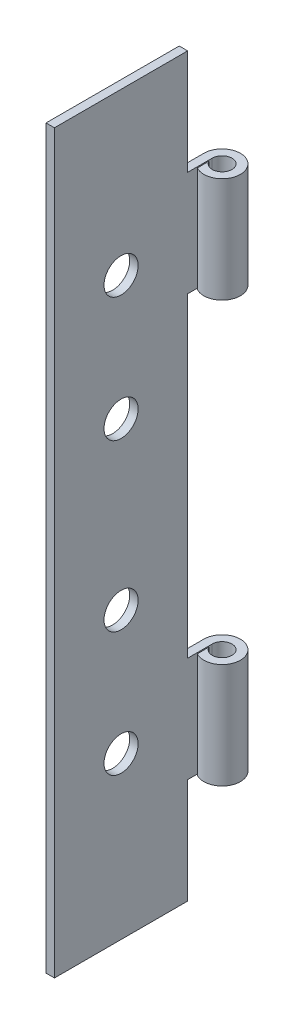
ISO-10303-21;
HEADER;
FILE_DESCRIPTION(('STEP AP214'),'2;1');
FILE_NAME('part.step','',(''),(''),'','','');
FILE_SCHEMA(('AUTOMOTIVE_DESIGN { 1 0 10303 214 1 1 1 1 }'));
ENDSEC;
DATA;
#1=APPLICATION_CONTEXT('core data for automotive mechanical design processes');
#2=APPLICATION_PROTOCOL_DEFINITION('international standard','automotive_design',2000,#1);
#3=PRODUCT_CONTEXT('',#1,'mechanical');
#4=PRODUCT('Part','Part','',(#3));
#5=PRODUCT_RELATED_PRODUCT_CATEGORY('part','',(#4));
#6=PRODUCT_DEFINITION_FORMATION('','',#4);
#7=PRODUCT_DEFINITION_CONTEXT('part definition',#1,'design');
#8=PRODUCT_DEFINITION('design','',#6,#7);
#9=PRODUCT_DEFINITION_SHAPE('','',#8);
#10=(LENGTH_UNIT() NAMED_UNIT(*) SI_UNIT(.MILLI.,.METRE.));
#11=(NAMED_UNIT(*) PLANE_ANGLE_UNIT() SI_UNIT($,.RADIAN.));
#12=(NAMED_UNIT(*) SI_UNIT($,.STERADIAN.) SOLID_ANGLE_UNIT());
#13=UNCERTAINTY_MEASURE_WITH_UNIT(LENGTH_MEASURE(1.E-05),#10,'distance_accuracy_value','');
#14=(GEOMETRIC_REPRESENTATION_CONTEXT(3) GLOBAL_UNCERTAINTY_ASSIGNED_CONTEXT((#13)) GLOBAL_UNIT_ASSIGNED_CONTEXT((#10,
#11,#12)) REPRESENTATION_CONTEXT('',''));
#15=CARTESIAN_POINT('',(0.,0.,0.));
#16=DIRECTION('',(0.,0.,1.));
#17=DIRECTION('',(1.,0.,0.));
#18=AXIS2_PLACEMENT_3D('',#15,#16,#17);
#19=CARTESIAN_POINT('',(0.,88.9,0.));
#20=DIRECTION('',(1.,0.,0.));
#21=DIRECTION('',(0.,0.,-1.));
#22=AXIS2_PLACEMENT_3D('',#19,#20,#21);
#23=PLANE('',#22);
#24=CARTESIAN_POINT('',(0.,19.450000028,11.0093125));
#25=DIRECTION('',(-1.,0.,0.));
#26=DIRECTION('',(0.,0.,-1.));
#27=AXIS2_PLACEMENT_3D('',#24,#25,#26);
#28=CIRCLE('',#27,2.06);
#29=CARTESIAN_POINT('',(0.,19.450000028,8.9493125));
#30=VERTEX_POINT('',#29);
#31=EDGE_CURVE('E385',#30,#30,#28,.T.);
#32=ORIENTED_EDGE('',*,*,#31,.F.);
#33=EDGE_LOOP('',(#32));
#34=FACE_BOUND('',#33,.T.);
#35=CARTESIAN_POINT('',(0.,69.449999972,11.0093125));
#36=DIRECTION('',(-1.,0.,0.));
#37=DIRECTION('',(0.,0.,1.));
#38=AXIS2_PLACEMENT_3D('',#35,#36,#37);
#39=CIRCLE('',#38,2.06);
#40=CARTESIAN_POINT('',(0.,69.449999972,13.0693125));
#41=VERTEX_POINT('',#40);
#42=EDGE_CURVE('E389',#41,#41,#39,.T.);
#43=ORIENTED_EDGE('',*,*,#42,.F.);
#44=EDGE_LOOP('',(#43));
#45=FACE_BOUND('',#44,.T.);
#46=CARTESIAN_POINT('',(0.,34.45,11.0093125));
#47=DIRECTION('',(-1.,0.,0.));
#48=DIRECTION('',(0.,0.,-1.));
#49=AXIS2_PLACEMENT_3D('',#46,#47,#48);
#50=CIRCLE('',#49,2.06);
#51=CARTESIAN_POINT('',(0.,34.45,8.9493125));
#52=VERTEX_POINT('',#51);
#53=EDGE_CURVE('E384',#52,#52,#50,.T.);
#54=ORIENTED_EDGE('',*,*,#53,.F.);
#55=EDGE_LOOP('',(#54));
#56=FACE_BOUND('',#55,.T.);
#57=CARTESIAN_POINT('',(0.,54.45,11.0093125));
#58=DIRECTION('',(-1.,0.,0.));
#59=DIRECTION('',(0.,0.,1.));
#60=AXIS2_PLACEMENT_3D('',#57,#58,#59);
#61=CIRCLE('',#60,2.06);
#62=CARTESIAN_POINT('',(0.,54.45,13.0693125));
#63=VERTEX_POINT('',#62);
#64=EDGE_CURVE('E248',#63,#63,#61,.T.);
#65=ORIENTED_EDGE('',*,*,#64,.F.);
#66=EDGE_LOOP('',(#65));
#67=FACE_BOUND('',#66,.T.);
#68=DIRECTION('',(0.,-1.,0.));
#69=VECTOR('',#68,1.);
#70=CARTESIAN_POINT('',(0.,63.5,2.968625));
#71=LINE('',#70,#69);
#72=CARTESIAN_POINT('',(0.,63.5,2.968625));
#73=VERTEX_POINT('',#72);
#74=CARTESIAN_POINT('',(0.,25.4,2.968625));
#75=VERTEX_POINT('',#74);
#76=EDGE_CURVE('E363',#73,#75,#71,.T.);
#77=ORIENTED_EDGE('',*,*,#76,.T.);
#78=DIRECTION('',(0.,0.,-1.));
#79=VECTOR('',#78,1.);
#80=CARTESIAN_POINT('',(0.,25.4,2.968625));
#81=LINE('',#80,#79);
#82=CARTESIAN_POINT('',(0.,25.4,0.));
#83=VERTEX_POINT('',#82);
#84=EDGE_CURVE('E274',#75,#83,#81,.T.);
#85=ORIENTED_EDGE('',*,*,#84,.T.);
#86=DIRECTION('',(0.,-1.,0.));
#87=VECTOR('',#86,1.);
#88=CARTESIAN_POINT('',(0.,88.9,0.));
#89=LINE('',#88,#87);
#90=CARTESIAN_POINT('',(0.,12.7,0.));
#91=VERTEX_POINT('',#90);
#92=EDGE_CURVE('E225',#83,#91,#89,.T.);
#93=ORIENTED_EDGE('',*,*,#92,.T.);
#94=DIRECTION('',(0.,0.,1.));
#95=VECTOR('',#94,1.);
#96=CARTESIAN_POINT('',(0.,12.7,2.968625));
#97=LINE('',#96,#95);
#98=CARTESIAN_POINT('',(0.,12.7,2.968625));
#99=VERTEX_POINT('',#98);
#100=EDGE_CURVE('E180',#91,#99,#97,.T.);
#101=ORIENTED_EDGE('',*,*,#100,.T.);
#102=DIRECTION('',(0.,-1.,0.));
#103=VECTOR('',#102,1.);
#104=CARTESIAN_POINT('',(0.,12.7,2.968625));
#105=LINE('',#104,#103);
#106=CARTESIAN_POINT('',(0.,0.,2.968625));
#107=VERTEX_POINT('',#106);
#108=EDGE_CURVE('E163',#99,#107,#105,.T.);
#109=ORIENTED_EDGE('',*,*,#108,.T.);
#110=DIRECTION('',(0.,0.,1.));
#111=VECTOR('',#110,1.);
#112=CARTESIAN_POINT('',(0.,0.,0.));
#113=LINE('',#112,#111);
#114=CARTESIAN_POINT('',(0.,0.,19.05));
#115=VERTEX_POINT('',#114);
#116=EDGE_CURVE('E177',#107,#115,#113,.T.);
#117=ORIENTED_EDGE('',*,*,#116,.T.);
#118=DIRECTION('',(0.,-1.,0.));
#119=VECTOR('',#118,1.);
#120=CARTESIAN_POINT('',(0.,88.9,19.05));
#121=LINE('',#120,#119);
#122=CARTESIAN_POINT('',(0.,88.9,19.05));
#123=VERTEX_POINT('',#122);
#124=EDGE_CURVE('E222',#123,#115,#121,.T.);
#125=ORIENTED_EDGE('',*,*,#124,.F.);
#126=DIRECTION('',(0.,0.,1.));
#127=VECTOR('',#126,1.);
#128=CARTESIAN_POINT('',(0.,88.9,0.));
#129=LINE('',#128,#127);
#130=CARTESIAN_POINT('',(0.,88.9,2.968625));
#131=VERTEX_POINT('',#130);
#132=EDGE_CURVE('E202',#131,#123,#129,.T.);
#133=ORIENTED_EDGE('',*,*,#132,.F.);
#134=DIRECTION('',(0.,-1.,0.));
#135=VECTOR('',#134,1.);
#136=CARTESIAN_POINT('',(0.,88.9,2.968625));
#137=LINE('',#136,#135);
#138=CARTESIAN_POINT('',(0.,76.2,2.968625));
#139=VERTEX_POINT('',#138);
#140=EDGE_CURVE('E70',#131,#139,#137,.T.);
#141=ORIENTED_EDGE('',*,*,#140,.T.);
#142=DIRECTION('',(0.,0.,-1.));
#143=VECTOR('',#142,1.);
#144=CARTESIAN_POINT('',(0.,76.2,2.968625));
#145=LINE('',#144,#143);
#146=CARTESIAN_POINT('',(0.,76.2,0.));
#147=VERTEX_POINT('',#146);
#148=EDGE_CURVE('E261',#139,#147,#145,.T.);
#149=ORIENTED_EDGE('',*,*,#148,.T.);
#150=CARTESIAN_POINT('',(0.,63.5,0.));
#151=VERTEX_POINT('',#150);
#152=EDGE_CURVE('E173',#147,#151,#89,.T.);
#153=ORIENTED_EDGE('',*,*,#152,.T.);
#154=DIRECTION('',(0.,0.,1.));
#155=VECTOR('',#154,1.);
#156=CARTESIAN_POINT('',(0.,63.5,2.968625));
#157=LINE('',#156,#155);
#158=EDGE_CURVE('E365',#151,#73,#157,.T.);
#159=ORIENTED_EDGE('',*,*,#158,.T.);
#160=EDGE_LOOP('',(#77,#85,#93,#101,#109,#117,#125,#133,#141,#149,#153,#159));
#161=FACE_BOUND('',#160,.T.);
#162=ADVANCED_FACE('F44',(#34,#45,#56,#67,#161),#23,.F.);
#163=CARTESIAN_POINT('',(1.016,88.9,19.05));
#164=DIRECTION('',(-1.,0.,0.));
#165=DIRECTION('',(0.,0.,1.));
#166=AXIS2_PLACEMENT_3D('',#163,#164,#165);
#167=PLANE('',#166);
#168=CARTESIAN_POINT('',(1.016,19.450000028,11.0093125));
#169=DIRECTION('',(-1.,0.,0.));
#170=DIRECTION('',(0.,0.,1.));
#171=AXIS2_PLACEMENT_3D('',#168,#169,#170);
#172=CIRCLE('',#171,2.06);
#173=CARTESIAN_POINT('',(1.016,19.450000028,13.0693125));
#174=VERTEX_POINT('',#173);
#175=EDGE_CURVE('E48',#174,#174,#172,.T.);
#176=ORIENTED_EDGE('',*,*,#175,.T.);
#177=EDGE_LOOP('',(#176));
#178=FACE_BOUND('',#177,.T.);
#179=CARTESIAN_POINT('',(1.016,69.449999972,11.0093125));
#180=DIRECTION('',(-1.,0.,0.));
#181=DIRECTION('',(0.,0.,1.));
#182=AXIS2_PLACEMENT_3D('',#179,#180,#181);
#183=CIRCLE('',#182,2.06);
#184=CARTESIAN_POINT('',(1.016,69.449999972,13.0693125));
#185=VERTEX_POINT('',#184);
#186=EDGE_CURVE('E251',#185,#185,#183,.T.);
#187=ORIENTED_EDGE('',*,*,#186,.T.);
#188=EDGE_LOOP('',(#187));
#189=FACE_BOUND('',#188,.T.);
#190=CARTESIAN_POINT('',(1.016,34.45,11.0093125));
#191=DIRECTION('',(-1.,0.,0.));
#192=DIRECTION('',(0.,0.,1.));
#193=AXIS2_PLACEMENT_3D('',#190,#191,#192);
#194=CIRCLE('',#193,2.06);
#195=CARTESIAN_POINT('',(1.016,34.45,13.0693125));
#196=VERTEX_POINT('',#195);
#197=EDGE_CURVE('E247',#196,#196,#194,.T.);
#198=ORIENTED_EDGE('',*,*,#197,.T.);
#199=EDGE_LOOP('',(#198));
#200=FACE_BOUND('',#199,.T.);
#201=CARTESIAN_POINT('',(1.016,54.45,11.0093125));
#202=DIRECTION('',(-1.,0.,0.));
#203=DIRECTION('',(0.,0.,1.));
#204=AXIS2_PLACEMENT_3D('',#201,#202,#203);
#205=CIRCLE('',#204,2.06);
#206=CARTESIAN_POINT('',(1.016,54.45,13.0693125));
#207=VERTEX_POINT('',#206);
#208=EDGE_CURVE('E243',#207,#207,#205,.T.);
#209=ORIENTED_EDGE('',*,*,#208,.T.);
#210=EDGE_LOOP('',(#209));
#211=FACE_BOUND('',#210,.T.);
#212=DIRECTION('',(0.,-1.,0.));
#213=VECTOR('',#212,1.);
#214=CARTESIAN_POINT('',(1.016,88.9,2.968625));
#215=LINE('',#214,#213);
#216=CARTESIAN_POINT('',(1.016,63.5,2.968625));
#217=VERTEX_POINT('',#216);
#218=CARTESIAN_POINT('',(1.016,25.4,2.968625));
#219=VERTEX_POINT('',#218);
#220=EDGE_CURVE('E11',#217,#219,#215,.T.);
#221=ORIENTED_EDGE('',*,*,#220,.F.);
#222=DIRECTION('',(0.,0.,1.));
#223=VECTOR('',#222,1.);
#224=CARTESIAN_POINT('',(1.016,63.5,19.05));
#225=LINE('',#224,#223);
#226=CARTESIAN_POINT('',(1.016,63.5,0.));
#227=VERTEX_POINT('',#226);
#228=EDGE_CURVE('E302',#227,#217,#225,.T.);
#229=ORIENTED_EDGE('',*,*,#228,.F.);
#230=DIRECTION('',(0.,-1.,0.));
#231=VECTOR('',#230,1.);
#232=CARTESIAN_POINT('',(1.016,88.9,0.));
#233=LINE('',#232,#231);
#234=CARTESIAN_POINT('',(1.016,76.2,0.));
#235=VERTEX_POINT('',#234);
#236=EDGE_CURVE('E217',#235,#227,#233,.T.);
#237=ORIENTED_EDGE('',*,*,#236,.F.);
#238=DIRECTION('',(0.,0.,-1.));
#239=VECTOR('',#238,1.);
#240=CARTESIAN_POINT('',(1.016,76.2,19.05));
#241=LINE('',#240,#239);
#242=CARTESIAN_POINT('',(1.016,76.2,2.968625));
#243=VERTEX_POINT('',#242);
#244=EDGE_CURVE('E284',#243,#235,#241,.T.);
#245=ORIENTED_EDGE('',*,*,#244,.F.);
#246=DIRECTION('',(0.,-1.,0.));
#247=VECTOR('',#246,1.);
#248=CARTESIAN_POINT('',(1.016,88.9,2.968625));
#249=LINE('',#248,#247);
#250=CARTESIAN_POINT('',(1.016,88.9,2.968625));
#251=VERTEX_POINT('',#250);
#252=EDGE_CURVE('E277',#251,#243,#249,.T.);
#253=ORIENTED_EDGE('',*,*,#252,.F.);
#254=DIRECTION('',(0.,0.,-1.));
#255=VECTOR('',#254,1.);
#256=CARTESIAN_POINT('',(1.016,88.9,19.05));
#257=LINE('',#256,#255);
#258=CARTESIAN_POINT('',(1.016,88.9,19.05));
#259=VERTEX_POINT('',#258);
#260=EDGE_CURVE('E197',#259,#251,#257,.T.);
#261=ORIENTED_EDGE('',*,*,#260,.F.);
#262=DIRECTION('',(0.,-1.,0.));
#263=VECTOR('',#262,1.);
#264=CARTESIAN_POINT('',(1.016,88.9,19.05));
#265=LINE('',#264,#263);
#266=CARTESIAN_POINT('',(1.016,0.,19.05));
#267=VERTEX_POINT('',#266);
#268=EDGE_CURVE('E218',#259,#267,#265,.T.);
#269=ORIENTED_EDGE('',*,*,#268,.T.);
#270=DIRECTION('',(0.,0.,-1.));
#271=VECTOR('',#270,1.);
#272=CARTESIAN_POINT('',(1.016,0.,19.05));
#273=LINE('',#272,#271);
#274=CARTESIAN_POINT('',(1.016,0.,2.968625));
#275=VERTEX_POINT('',#274);
#276=EDGE_CURVE('E192',#267,#275,#273,.T.);
#277=ORIENTED_EDGE('',*,*,#276,.T.);
#278=DIRECTION('',(0.,-1.,0.));
#279=VECTOR('',#278,1.);
#280=CARTESIAN_POINT('',(1.016,88.9,2.968625));
#281=LINE('',#280,#279);
#282=CARTESIAN_POINT('',(1.016,12.7,2.968625));
#283=VERTEX_POINT('',#282);
#284=EDGE_CURVE('E166',#283,#275,#281,.T.);
#285=ORIENTED_EDGE('',*,*,#284,.F.);
#286=DIRECTION('',(0.,0.,1.));
#287=VECTOR('',#286,1.);
#288=CARTESIAN_POINT('',(1.016,12.7,19.05));
#289=LINE('',#288,#287);
#290=CARTESIAN_POINT('',(1.016,12.7,0.));
#291=VERTEX_POINT('',#290);
#292=EDGE_CURVE('E194',#291,#283,#289,.T.);
#293=ORIENTED_EDGE('',*,*,#292,.F.);
#294=CARTESIAN_POINT('',(1.016,25.4,0.));
#295=VERTEX_POINT('',#294);
#296=EDGE_CURVE('E213',#295,#291,#233,.T.);
#297=ORIENTED_EDGE('',*,*,#296,.F.);
#298=DIRECTION('',(0.,0.,-1.));
#299=VECTOR('',#298,1.);
#300=CARTESIAN_POINT('',(1.016,25.4,19.05));
#301=LINE('',#300,#299);
#302=EDGE_CURVE('E293',#219,#295,#301,.T.);
#303=ORIENTED_EDGE('',*,*,#302,.F.);
#304=EDGE_LOOP('',(#221,#229,#237,#245,#253,#261,#269,#277,#285,#293,#297,#303));
#305=FACE_BOUND('',#304,.T.);
#306=ADVANCED_FACE('F325',(#178,#189,#200,#211,#305),#167,.F.);
#307=CARTESIAN_POINT('',(2.206625,88.9,0.));
#308=DIRECTION('',(0.,-1.,0.));
#309=DIRECTION('',(0.,0.,-1.));
#310=AXIS2_PLACEMENT_3D('',#307,#308,#309);
#311=CYLINDRICAL_SURFACE('',#310,2.206625);
#312=DIRECTION('',(0.,-1.,0.));
#313=VECTOR('',#312,1.);
#314=CARTESIAN_POINT('',(1.143,88.9,1.93336384315007));
#315=LINE('',#314,#313);
#316=CARTESIAN_POINT('',(1.143,25.4,1.93336384315007));
#317=VERTEX_POINT('',#316);
#318=CARTESIAN_POINT('',(1.143,12.7,1.93336384315007));
#319=VERTEX_POINT('',#318);
#320=EDGE_CURVE('E203',#317,#319,#315,.T.);
#321=ORIENTED_EDGE('',*,*,#320,.T.);
#322=CARTESIAN_POINT('',(2.206625,12.7,0.));
#323=DIRECTION('',(0.,-1.,0.));
#324=DIRECTION('',(0.,0.,-1.));
#325=AXIS2_PLACEMENT_3D('',#322,#323,#324);
#326=CIRCLE('',#325,2.206625);
#327=EDGE_CURVE('E188',#91,#319,#326,.T.);
#328=ORIENTED_EDGE('',*,*,#327,.F.);
#329=ORIENTED_EDGE('',*,*,#92,.F.);
#330=CARTESIAN_POINT('',(2.206625,25.4,0.));
#331=DIRECTION('',(0.,1.,0.));
#332=DIRECTION('',(0.,0.,1.));
#333=AXIS2_PLACEMENT_3D('',#330,#331,#332);
#334=CIRCLE('',#333,2.206625);
#335=EDGE_CURVE('E296',#317,#83,#334,.T.);
#336=ORIENTED_EDGE('',*,*,#335,.F.);
#337=EDGE_LOOP('',(#321,#328,#329,#336));
#338=FACE_BOUND('',#337,.T.);
#339=ADVANCED_FACE('F46',(#338),#311,.T.);
#340=CARTESIAN_POINT('',(1.143,76.2,1.93336384315007));
#341=VERTEX_POINT('',#340);
#342=CARTESIAN_POINT('',(1.143,63.5,1.93336384315007));
#343=VERTEX_POINT('',#342);
#344=EDGE_CURVE('E207',#341,#343,#315,.T.);
#345=ORIENTED_EDGE('',*,*,#344,.T.);
#346=CARTESIAN_POINT('',(2.206625,63.5,0.));
#347=DIRECTION('',(0.,-1.,0.));
#348=DIRECTION('',(0.,0.,-1.));
#349=AXIS2_PLACEMENT_3D('',#346,#347,#348);
#350=CIRCLE('',#349,2.206625);
#351=EDGE_CURVE('E62',#151,#343,#350,.T.);
#352=ORIENTED_EDGE('',*,*,#351,.F.);
#353=ORIENTED_EDGE('',*,*,#152,.F.);
#354=CARTESIAN_POINT('',(2.206625,76.2,0.));
#355=DIRECTION('',(0.,1.,0.));
#356=DIRECTION('',(0.,0.,1.));
#357=AXIS2_PLACEMENT_3D('',#354,#355,#356);
#358=CIRCLE('',#357,2.206625);
#359=EDGE_CURVE('E287',#341,#147,#358,.T.);
#360=ORIENTED_EDGE('',*,*,#359,.F.);
#361=EDGE_LOOP('',(#345,#352,#353,#360));
#362=FACE_BOUND('',#361,.T.);
#363=ADVANCED_FACE('F339',(#362),#311,.T.);
#364=CARTESIAN_POINT('',(2.206625,88.9,0.));
#365=DIRECTION('',(0.,-1.,0.));
#366=DIRECTION('',(0.,0.,-1.));
#367=AXIS2_PLACEMENT_3D('',#364,#365,#366);
#368=CYLINDRICAL_SURFACE('',#367,1.190625);
#369=CARTESIAN_POINT('',(2.206625,12.7,0.));
#370=DIRECTION('',(0.,-1.,0.));
#371=DIRECTION('',(0.,0.,-1.));
#372=AXIS2_PLACEMENT_3D('',#369,#370,#371);
#373=CIRCLE('',#372,1.190625);
#374=CARTESIAN_POINT('',(1.143,12.7,0.535060510596702));
#375=VERTEX_POINT('',#374);
#376=EDGE_CURVE('E308',#375,#291,#373,.F.);
#377=ORIENTED_EDGE('',*,*,#376,.F.);
#378=DIRECTION('',(0.,-1.,0.));
#379=VECTOR('',#378,1.);
#380=CARTESIAN_POINT('',(1.143,88.9,0.535060510596702));
#381=LINE('',#380,#379);
#382=CARTESIAN_POINT('',(1.143,25.4,0.535060510596702));
#383=VERTEX_POINT('',#382);
#384=EDGE_CURVE('E208',#383,#375,#381,.T.);
#385=ORIENTED_EDGE('',*,*,#384,.F.);
#386=CARTESIAN_POINT('',(2.206625,25.4,0.));
#387=DIRECTION('',(0.,1.,0.));
#388=DIRECTION('',(0.,0.,1.));
#389=AXIS2_PLACEMENT_3D('',#386,#387,#388);
#390=CIRCLE('',#389,1.190625);
#391=EDGE_CURVE('E290',#295,#383,#390,.F.);
#392=ORIENTED_EDGE('',*,*,#391,.F.);
#393=ORIENTED_EDGE('',*,*,#296,.T.);
#394=EDGE_LOOP('',(#377,#385,#392,#393));
#395=FACE_BOUND('',#394,.T.);
#396=ADVANCED_FACE('F419',(#395),#368,.F.);
#397=CARTESIAN_POINT('',(2.206625,63.5,0.));
#398=DIRECTION('',(0.,-1.,0.));
#399=DIRECTION('',(0.,0.,-1.));
#400=AXIS2_PLACEMENT_3D('',#397,#398,#399);
#401=CIRCLE('',#400,1.190625);
#402=CARTESIAN_POINT('',(1.143,63.5,0.535060510596702));
#403=VERTEX_POINT('',#402);
#404=EDGE_CURVE('E299',#403,#227,#401,.F.);
#405=ORIENTED_EDGE('',*,*,#404,.F.);
#406=CARTESIAN_POINT('',(1.143,76.2,0.535060510596702));
#407=VERTEX_POINT('',#406);
#408=EDGE_CURVE('E212',#407,#403,#381,.T.);
#409=ORIENTED_EDGE('',*,*,#408,.F.);
#410=CARTESIAN_POINT('',(2.206625,76.2,0.));
#411=DIRECTION('',(0.,1.,0.));
#412=DIRECTION('',(0.,0.,1.));
#413=AXIS2_PLACEMENT_3D('',#410,#411,#412);
#414=CIRCLE('',#413,1.190625);
#415=EDGE_CURVE('E281',#235,#407,#414,.F.);
#416=ORIENTED_EDGE('',*,*,#415,.F.);
#417=ORIENTED_EDGE('',*,*,#236,.T.);
#418=EDGE_LOOP('',(#405,#409,#416,#417));
#419=FACE_BOUND('',#418,.T.);
#420=ADVANCED_FACE('F355',(#419),#368,.F.);
#421=CARTESIAN_POINT('',(1.143,88.9,0.535060510596702));
#422=DIRECTION('',(1.,0.,0.));
#423=DIRECTION('',(0.,0.,-1.));
#424=AXIS2_PLACEMENT_3D('',#421,#422,#423);
#425=PLANE('',#424);
#426=DIRECTION('',(0.,0.,-1.));
#427=VECTOR('',#426,1.);
#428=CARTESIAN_POINT('',(1.143,12.7,0.535060510596702));
#429=LINE('',#428,#427);
#430=EDGE_CURVE('E54',#319,#375,#429,.T.);
#431=ORIENTED_EDGE('',*,*,#430,.F.);
#432=ORIENTED_EDGE('',*,*,#320,.F.);
#433=DIRECTION('',(0.,0.,1.));
#434=VECTOR('',#433,1.);
#435=CARTESIAN_POINT('',(1.143,25.4,0.535060510596702));
#436=LINE('',#435,#434);
#437=EDGE_CURVE('E234',#383,#317,#436,.T.);
#438=ORIENTED_EDGE('',*,*,#437,.F.);
#439=ORIENTED_EDGE('',*,*,#384,.T.);
#440=EDGE_LOOP('',(#431,#432,#438,#439));
#441=FACE_BOUND('',#440,.T.);
#442=ADVANCED_FACE('F437',(#441),#425,.F.);
#443=DIRECTION('',(0.,0.,-1.));
#444=VECTOR('',#443,1.);
#445=CARTESIAN_POINT('',(1.143,63.5,0.535060510596702));
#446=LINE('',#445,#444);
#447=EDGE_CURVE('E238',#343,#403,#446,.T.);
#448=ORIENTED_EDGE('',*,*,#447,.F.);
#449=ORIENTED_EDGE('',*,*,#344,.F.);
#450=DIRECTION('',(0.,0.,1.));
#451=VECTOR('',#450,1.);
#452=CARTESIAN_POINT('',(1.143,76.2,0.535060510596702));
#453=LINE('',#452,#451);
#454=EDGE_CURVE('E230',#407,#341,#453,.T.);
#455=ORIENTED_EDGE('',*,*,#454,.F.);
#456=ORIENTED_EDGE('',*,*,#408,.T.);
#457=EDGE_LOOP('',(#448,#449,#455,#456));
#458=FACE_BOUND('',#457,.T.);
#459=ADVANCED_FACE('F349',(#458),#425,.F.);
#460=CARTESIAN_POINT('',(2.206625,88.9,0.));
#461=DIRECTION('',(0.,1.,0.));
#462=DIRECTION('',(0.,0.,1.));
#463=AXIS2_PLACEMENT_3D('',#460,#461,#462);
#464=PLANE('',#463);
#465=ORIENTED_EDGE('',*,*,#260,.T.);
#466=DIRECTION('',(-1.,0.,0.));
#467=VECTOR('',#466,1.);
#468=CARTESIAN_POINT('',(2.206625,88.9,2.968625));
#469=LINE('',#468,#467);
#470=EDGE_CURVE('E172',#251,#131,#469,.T.);
#471=ORIENTED_EDGE('',*,*,#470,.T.);
#472=ORIENTED_EDGE('',*,*,#132,.T.);
#473=DIRECTION('',(1.,0.,0.));
#474=VECTOR('',#473,1.);
#475=CARTESIAN_POINT('',(0.,88.9,19.05));
#476=LINE('',#475,#474);
#477=EDGE_CURVE('E314',#123,#259,#476,.T.);
#478=ORIENTED_EDGE('',*,*,#477,.T.);
#479=EDGE_LOOP('',(#465,#471,#472,#478));
#480=FACE_BOUND('',#479,.T.);
#481=ADVANCED_FACE('F322',(#480),#464,.T.);
#482=CARTESIAN_POINT('',(2.206625,0.,0.));
#483=DIRECTION('',(0.,1.,0.));
#484=DIRECTION('',(0.,0.,1.));
#485=AXIS2_PLACEMENT_3D('',#482,#483,#484);
#486=PLANE('',#485);
#487=DIRECTION('',(-1.,0.,0.));
#488=VECTOR('',#487,1.);
#489=CARTESIAN_POINT('',(2.206625,0.,2.968625));
#490=LINE('',#489,#488);
#491=EDGE_CURVE('E159',#275,#107,#490,.T.);
#492=ORIENTED_EDGE('',*,*,#491,.F.);
#493=ORIENTED_EDGE('',*,*,#276,.F.);
#494=DIRECTION('',(1.,0.,0.));
#495=VECTOR('',#494,1.);
#496=CARTESIAN_POINT('',(0.,0.,19.05));
#497=LINE('',#496,#495);
#498=EDGE_CURVE('E186',#115,#267,#497,.T.);
#499=ORIENTED_EDGE('',*,*,#498,.F.);
#500=ORIENTED_EDGE('',*,*,#116,.F.);
#501=EDGE_LOOP('',(#492,#493,#499,#500));
#502=FACE_BOUND('',#501,.T.);
#503=ADVANCED_FACE('F185',(#502),#486,.F.);
#504=CARTESIAN_POINT('',(0.,88.9,19.05));
#505=DIRECTION('',(0.,0.,-1.));
#506=DIRECTION('',(-1.,0.,0.));
#507=AXIS2_PLACEMENT_3D('',#504,#505,#506);
#508=PLANE('',#507);
#509=ORIENTED_EDGE('',*,*,#498,.T.);
#510=ORIENTED_EDGE('',*,*,#268,.F.);
#511=ORIENTED_EDGE('',*,*,#477,.F.);
#512=ORIENTED_EDGE('',*,*,#124,.T.);
#513=EDGE_LOOP('',(#509,#510,#511,#512));
#514=FACE_BOUND('',#513,.T.);
#515=ADVANCED_FACE('F421',(#514),#508,.F.);
#516=CARTESIAN_POINT('',(4.41325,12.7,2.968625));
#517=DIRECTION('',(0.,-1.,0.));
#518=DIRECTION('',(0.,0.,-1.));
#519=AXIS2_PLACEMENT_3D('',#516,#517,#518);
#520=PLANE('',#519);
#521=ORIENTED_EDGE('',*,*,#327,.T.);
#522=ORIENTED_EDGE('',*,*,#430,.T.);
#523=ORIENTED_EDGE('',*,*,#376,.T.);
#524=ORIENTED_EDGE('',*,*,#292,.T.);
#525=DIRECTION('',(-1.,0.,0.));
#526=VECTOR('',#525,1.);
#527=CARTESIAN_POINT('',(4.41325,12.7,2.968625));
#528=LINE('',#527,#526);
#529=EDGE_CURVE('E278',#283,#99,#528,.T.);
#530=ORIENTED_EDGE('',*,*,#529,.T.);
#531=ORIENTED_EDGE('',*,*,#100,.F.);
#532=EDGE_LOOP('',(#521,#522,#523,#524,#530,#531));
#533=FACE_BOUND('',#532,.T.);
#534=ADVANCED_FACE('F423',(#533),#520,.T.);
#535=CARTESIAN_POINT('',(4.41325,12.7,2.968625));
#536=DIRECTION('',(0.,0.,-1.));
#537=DIRECTION('',(0.,1.,0.));
#538=AXIS2_PLACEMENT_3D('',#535,#536,#537);
#539=PLANE('',#538);
#540=ORIENTED_EDGE('',*,*,#284,.T.);
#541=ORIENTED_EDGE('',*,*,#491,.T.);
#542=ORIENTED_EDGE('',*,*,#108,.F.);
#543=ORIENTED_EDGE('',*,*,#529,.F.);
#544=EDGE_LOOP('',(#540,#541,#542,#543));
#545=FACE_BOUND('',#544,.T.);
#546=ADVANCED_FACE('F161',(#545),#539,.T.);
#547=CARTESIAN_POINT('',(4.41325,76.2,2.968625));
#548=DIRECTION('',(0.,1.,0.));
#549=DIRECTION('',(0.,0.,1.));
#550=AXIS2_PLACEMENT_3D('',#547,#548,#549);
#551=PLANE('',#550);
#552=ORIENTED_EDGE('',*,*,#359,.T.);
#553=ORIENTED_EDGE('',*,*,#148,.F.);
#554=DIRECTION('',(-1.,0.,0.));
#555=VECTOR('',#554,1.);
#556=CARTESIAN_POINT('',(4.41325,76.2,2.968625));
#557=LINE('',#556,#555);
#558=EDGE_CURVE('E266',#243,#139,#557,.T.);
#559=ORIENTED_EDGE('',*,*,#558,.F.);
#560=ORIENTED_EDGE('',*,*,#244,.T.);
#561=ORIENTED_EDGE('',*,*,#415,.T.);
#562=ORIENTED_EDGE('',*,*,#454,.T.);
#563=EDGE_LOOP('',(#552,#553,#559,#560,#561,#562));
#564=FACE_BOUND('',#563,.T.);
#565=ADVANCED_FACE('F332',(#564),#551,.T.);
#566=CARTESIAN_POINT('',(4.41325,88.9,2.968625));
#567=DIRECTION('',(0.,0.,-1.));
#568=DIRECTION('',(0.,1.,0.));
#569=AXIS2_PLACEMENT_3D('',#566,#567,#568);
#570=PLANE('',#569);
#571=ORIENTED_EDGE('',*,*,#252,.T.);
#572=ORIENTED_EDGE('',*,*,#558,.T.);
#573=ORIENTED_EDGE('',*,*,#140,.F.);
#574=ORIENTED_EDGE('',*,*,#470,.F.);
#575=EDGE_LOOP('',(#571,#572,#573,#574));
#576=FACE_BOUND('',#575,.T.);
#577=ADVANCED_FACE('F329',(#576),#570,.T.);
#578=CARTESIAN_POINT('',(4.41325,25.4,2.968625));
#579=DIRECTION('',(0.,1.,0.));
#580=DIRECTION('',(0.,0.,1.));
#581=AXIS2_PLACEMENT_3D('',#578,#579,#580);
#582=PLANE('',#581);
#583=ORIENTED_EDGE('',*,*,#335,.T.);
#584=ORIENTED_EDGE('',*,*,#84,.F.);
#585=DIRECTION('',(-1.,0.,0.));
#586=VECTOR('',#585,1.);
#587=CARTESIAN_POINT('',(4.41325,25.4,2.968625));
#588=LINE('',#587,#586);
#589=EDGE_CURVE('E269',#219,#75,#588,.T.);
#590=ORIENTED_EDGE('',*,*,#589,.F.);
#591=ORIENTED_EDGE('',*,*,#302,.T.);
#592=ORIENTED_EDGE('',*,*,#391,.T.);
#593=ORIENTED_EDGE('',*,*,#437,.T.);
#594=EDGE_LOOP('',(#583,#584,#590,#591,#592,#593));
#595=FACE_BOUND('',#594,.T.);
#596=ADVANCED_FACE('F451',(#595),#582,.T.);
#597=CARTESIAN_POINT('',(4.41325,63.5,2.968625));
#598=DIRECTION('',(0.,0.,-1.));
#599=DIRECTION('',(0.,1.,0.));
#600=AXIS2_PLACEMENT_3D('',#597,#598,#599);
#601=PLANE('',#600);
#602=DIRECTION('',(-1.,0.,0.));
#603=VECTOR('',#602,1.);
#604=CARTESIAN_POINT('',(4.41325,63.5,2.968625));
#605=LINE('',#604,#603);
#606=EDGE_CURVE('E182',#217,#73,#605,.T.);
#607=ORIENTED_EDGE('',*,*,#606,.F.);
#608=ORIENTED_EDGE('',*,*,#220,.T.);
#609=ORIENTED_EDGE('',*,*,#589,.T.);
#610=ORIENTED_EDGE('',*,*,#76,.F.);
#611=EDGE_LOOP('',(#607,#608,#609,#610));
#612=FACE_BOUND('',#611,.T.);
#613=ADVANCED_FACE('F360',(#612),#601,.T.);
#614=CARTESIAN_POINT('',(4.41325,63.5,2.968625));
#615=DIRECTION('',(0.,-1.,0.));
#616=DIRECTION('',(0.,0.,-1.));
#617=AXIS2_PLACEMENT_3D('',#614,#615,#616);
#618=PLANE('',#617);
#619=ORIENTED_EDGE('',*,*,#351,.T.);
#620=ORIENTED_EDGE('',*,*,#447,.T.);
#621=ORIENTED_EDGE('',*,*,#404,.T.);
#622=ORIENTED_EDGE('',*,*,#228,.T.);
#623=ORIENTED_EDGE('',*,*,#606,.T.);
#624=ORIENTED_EDGE('',*,*,#158,.F.);
#625=EDGE_LOOP('',(#619,#620,#621,#622,#623,#624));
#626=FACE_BOUND('',#625,.T.);
#627=ADVANCED_FACE('F352',(#626),#618,.T.);
#628=CARTESIAN_POINT('',(2.54,54.45,11.0093125));
#629=DIRECTION('',(-1.,0.,0.));
#630=DIRECTION('',(0.,0.,1.));
#631=AXIS2_PLACEMENT_3D('',#628,#629,#630);
#632=CYLINDRICAL_SURFACE('',#631,2.06);
#633=ORIENTED_EDGE('',*,*,#64,.T.);
#634=EDGE_LOOP('',(#633));
#635=FACE_BOUND('',#634,.T.);
#636=ORIENTED_EDGE('',*,*,#208,.F.);
#637=EDGE_LOOP('',(#636));
#638=FACE_BOUND('',#637,.T.);
#639=ADVANCED_FACE('F405',(#635,#638),#632,.F.);
#640=CARTESIAN_POINT('',(2.54,34.45,11.0093125));
#641=DIRECTION('',(-1.,0.,0.));
#642=DIRECTION('',(0.,0.,1.));
#643=AXIS2_PLACEMENT_3D('',#640,#641,#642);
#644=CYLINDRICAL_SURFACE('',#643,2.06);
#645=ORIENTED_EDGE('',*,*,#53,.T.);
#646=EDGE_LOOP('',(#645));
#647=FACE_BOUND('',#646,.T.);
#648=ORIENTED_EDGE('',*,*,#197,.F.);
#649=EDGE_LOOP('',(#648));
#650=FACE_BOUND('',#649,.T.);
#651=ADVANCED_FACE('F397',(#647,#650),#644,.F.);
#652=CARTESIAN_POINT('',(2.54,69.449999972,11.0093125));
#653=DIRECTION('',(-1.,0.,0.));
#654=DIRECTION('',(0.,0.,1.));
#655=AXIS2_PLACEMENT_3D('',#652,#653,#654);
#656=CYLINDRICAL_SURFACE('',#655,2.06);
#657=ORIENTED_EDGE('',*,*,#42,.T.);
#658=EDGE_LOOP('',(#657));
#659=FACE_BOUND('',#658,.T.);
#660=ORIENTED_EDGE('',*,*,#186,.F.);
#661=EDGE_LOOP('',(#660));
#662=FACE_BOUND('',#661,.T.);
#663=ADVANCED_FACE('F548',(#659,#662),#656,.F.);
#664=CARTESIAN_POINT('',(2.54,19.450000028,11.0093125));
#665=DIRECTION('',(-1.,0.,0.));
#666=DIRECTION('',(0.,0.,1.));
#667=AXIS2_PLACEMENT_3D('',#664,#665,#666);
#668=CYLINDRICAL_SURFACE('',#667,2.06);
#669=ORIENTED_EDGE('',*,*,#31,.T.);
#670=EDGE_LOOP('',(#669));
#671=FACE_BOUND('',#670,.T.);
#672=ORIENTED_EDGE('',*,*,#175,.F.);
#673=EDGE_LOOP('',(#672));
#674=FACE_BOUND('',#673,.T.);
#675=ADVANCED_FACE('F556',(#671,#674),#668,.F.);
#676=CLOSED_SHELL('',(#162,#306,#339,#363,#396,#420,#442,#459,#481,#503,#515,#534,#546,#565,
#577,#596,#613,#627,#639,#651,#663,#675));
#677=MANIFOLD_SOLID_BREP('B2',#676);
#678=ADVANCED_BREP_SHAPE_REPRESENTATION('',(#18,#677),#14);
#679=SHAPE_DEFINITION_REPRESENTATION(#9,#678);
ENDSEC;
END-ISO-10303-21;
